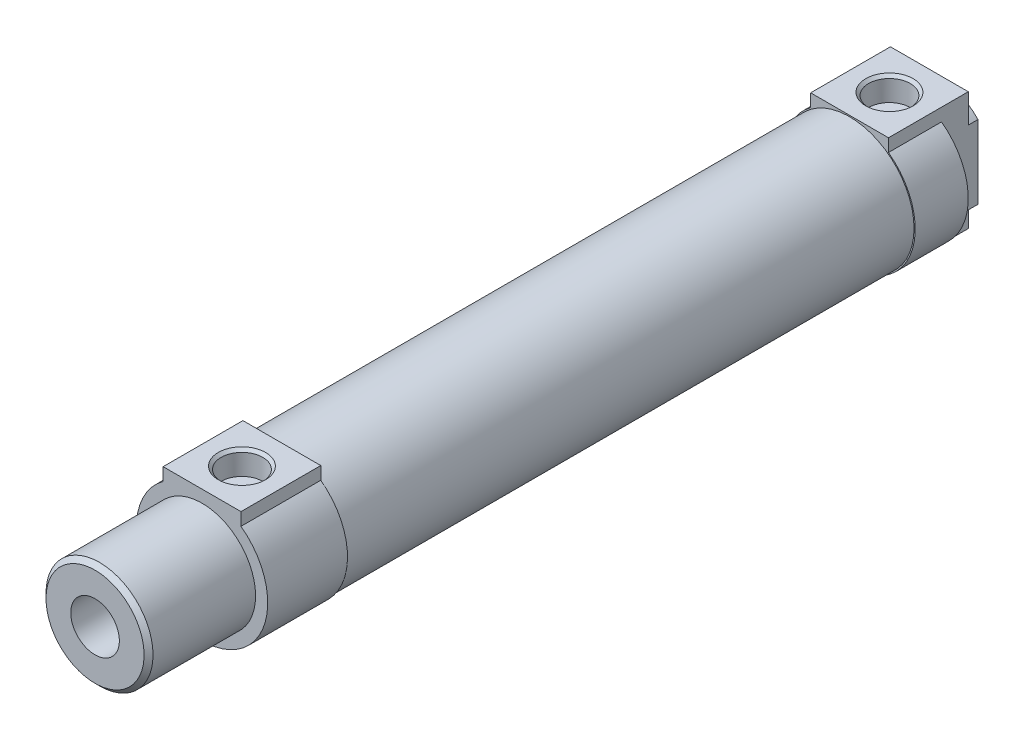
ISO-10303-21;
HEADER;
FILE_DESCRIPTION(('STEP AP214'),'2;1');
FILE_NAME('part.step','',(''),(''),'','','');
FILE_SCHEMA(('AUTOMOTIVE_DESIGN { 1 0 10303 214 1 1 1 1 }'));
ENDSEC;
DATA;
#1=APPLICATION_CONTEXT('core data for automotive mechanical design processes');
#2=APPLICATION_PROTOCOL_DEFINITION('international standard','automotive_design',2000,#1);
#3=PRODUCT_CONTEXT('',#1,'mechanical');
#4=PRODUCT('Part','Part','',(#3));
#5=PRODUCT_RELATED_PRODUCT_CATEGORY('part','',(#4));
#6=PRODUCT_DEFINITION_FORMATION('','',#4);
#7=PRODUCT_DEFINITION_CONTEXT('part definition',#1,'design');
#8=PRODUCT_DEFINITION('design','',#6,#7);
#9=PRODUCT_DEFINITION_SHAPE('','',#8);
#10=(LENGTH_UNIT() NAMED_UNIT(*) SI_UNIT(.MILLI.,.METRE.));
#11=(NAMED_UNIT(*) PLANE_ANGLE_UNIT() SI_UNIT($,.RADIAN.));
#12=(NAMED_UNIT(*) SI_UNIT($,.STERADIAN.) SOLID_ANGLE_UNIT());
#13=UNCERTAINTY_MEASURE_WITH_UNIT(LENGTH_MEASURE(1.E-05),#10,'distance_accuracy_value','');
#14=(GEOMETRIC_REPRESENTATION_CONTEXT(3) GLOBAL_UNCERTAINTY_ASSIGNED_CONTEXT((#13)) GLOBAL_UNIT_ASSIGNED_CONTEXT((#10,
#11,#12)) REPRESENTATION_CONTEXT('',''));
#15=CARTESIAN_POINT('',(0.,0.,0.));
#16=DIRECTION('',(0.,0.,1.));
#17=DIRECTION('',(1.,0.,0.));
#18=AXIS2_PLACEMENT_3D('',#15,#16,#17);
#19=CARTESIAN_POINT('',(0.,0.,-160.04));
#20=DIRECTION('',(0.,0.,1.));
#21=DIRECTION('',(1.,0.,0.));
#22=AXIS2_PLACEMENT_3D('',#19,#20,#21);
#23=CYLINDRICAL_SURFACE('',#22,11.);
#24=DIRECTION('',(0.,0.,1.));
#25=VECTOR('',#24,1.);
#26=CARTESIAN_POINT('',(-7.99999999999999,-7.54983443527077,-144.));
#27=LINE('',#26,#25);
#28=CARTESIAN_POINT('',(-7.99999999999999,-7.54983443527076,-149.5));
#29=VERTEX_POINT('',#28);
#30=CARTESIAN_POINT('',(-7.99999999999999,-7.54983443527077,-151.5));
#31=VERTEX_POINT('',#30);
#32=EDGE_CURVE('E145',#29,#31,#27,.F.);
#33=ORIENTED_EDGE('',*,*,#32,.T.);
#34=CARTESIAN_POINT('',(0.,0.,-151.5));
#35=DIRECTION('',(0.,0.,-1.));
#36=DIRECTION('',(-1.,0.,0.));
#37=AXIS2_PLACEMENT_3D('',#34,#35,#36);
#38=CIRCLE('',#37,11.);
#39=CARTESIAN_POINT('',(8.00000000000001,-7.54983443527074,-151.5));
#40=VERTEX_POINT('',#39);
#41=EDGE_CURVE('E51',#40,#31,#38,.T.);
#42=ORIENTED_EDGE('',*,*,#41,.F.);
#43=DIRECTION('',(0.,0.,1.));
#44=VECTOR('',#43,1.);
#45=CARTESIAN_POINT('',(8.00000000000001,-7.54983443527074,-172.5));
#46=LINE('',#45,#44);
#47=CARTESIAN_POINT('',(8.00000000000001,-7.54983443527074,-149.5));
#48=VERTEX_POINT('',#47);
#49=EDGE_CURVE('E151',#40,#48,#46,.T.);
#50=ORIENTED_EDGE('',*,*,#49,.T.);
#51=CARTESIAN_POINT('',(0.,0.,-149.5));
#52=DIRECTION('',(0.,0.,1.));
#53=DIRECTION('',(1.,0.,0.));
#54=AXIS2_PLACEMENT_3D('',#51,#52,#53);
#55=CIRCLE('',#54,11.);
#56=EDGE_CURVE('E137',#48,#29,#55,.F.);
#57=ORIENTED_EDGE('',*,*,#56,.T.);
#58=EDGE_LOOP('',(#33,#42,#50,#57));
#59=FACE_BOUND('',#58,.T.);
#60=ADVANCED_FACE('F34',(#59),#23,.T.);
#61=CARTESIAN_POINT('',(0.,0.,-160.04));
#62=DIRECTION('',(0.,0.,1.));
#63=DIRECTION('',(1.,0.,0.));
#64=AXIS2_PLACEMENT_3D('',#61,#62,#63);
#65=CYLINDRICAL_SURFACE('',#64,11.);
#66=DIRECTION('',(0.,0.,1.));
#67=VECTOR('',#66,1.);
#68=CARTESIAN_POINT('',(8.00000000000001,7.54983443527074,-172.5));
#69=LINE('',#68,#67);
#70=CARTESIAN_POINT('',(8.00000000000001,7.54983443527074,-149.5));
#71=VERTEX_POINT('',#70);
#72=CARTESIAN_POINT('',(8.00000000000001,7.54983443527074,-151.5));
#73=VERTEX_POINT('',#72);
#74=EDGE_CURVE('E289',#71,#73,#69,.F.);
#75=ORIENTED_EDGE('',*,*,#74,.T.);
#76=CARTESIAN_POINT('',(0.,0.,-151.5));
#77=DIRECTION('',(0.,0.,-1.));
#78=DIRECTION('',(-1.,0.,0.));
#79=AXIS2_PLACEMENT_3D('',#76,#77,#78);
#80=CIRCLE('',#79,11.);
#81=CARTESIAN_POINT('',(-7.99999999999998,7.54983443527077,-151.5));
#82=VERTEX_POINT('',#81);
#83=EDGE_CURVE('E318',#82,#73,#80,.T.);
#84=ORIENTED_EDGE('',*,*,#83,.F.);
#85=DIRECTION('',(0.,0.,1.));
#86=VECTOR('',#85,1.);
#87=CARTESIAN_POINT('',(-7.99999999999999,7.54983443527077,-144.));
#88=LINE('',#87,#86);
#89=CARTESIAN_POINT('',(-7.99999999999999,7.54983443527077,-149.5));
#90=VERTEX_POINT('',#89);
#91=EDGE_CURVE('E158',#82,#90,#88,.T.);
#92=ORIENTED_EDGE('',*,*,#91,.T.);
#93=CARTESIAN_POINT('',(0.,0.,-149.5));
#94=DIRECTION('',(0.,0.,1.));
#95=DIRECTION('',(1.,0.,0.));
#96=AXIS2_PLACEMENT_3D('',#93,#94,#95);
#97=CIRCLE('',#96,11.);
#98=EDGE_CURVE('E152',#71,#90,#97,.T.);
#99=ORIENTED_EDGE('',*,*,#98,.F.);
#100=EDGE_LOOP('',(#75,#84,#92,#99));
#101=FACE_BOUND('',#100,.T.);
#102=ADVANCED_FACE('F330',(#101),#65,.T.);
#103=CARTESIAN_POINT('',(8.00000000000001,27.,-172.5));
#104=DIRECTION('',(-1.,0.,0.));
#105=DIRECTION('',(0.,0.,1.));
#106=AXIS2_PLACEMENT_3D('',#103,#104,#105);
#107=PLANE('',#106);
#108=DIRECTION('',(0.,-1.,0.));
#109=VECTOR('',#108,1.);
#110=CARTESIAN_POINT('',(8.00000000000001,-7.54983443527074,-151.5));
#111=LINE('',#110,#109);
#112=EDGE_CURVE('E315',#73,#40,#111,.T.);
#113=ORIENTED_EDGE('',*,*,#112,.F.);
#114=ORIENTED_EDGE('',*,*,#74,.F.);
#115=DIRECTION('',(0.,1.,0.));
#116=VECTOR('',#115,1.);
#117=CARTESIAN_POINT('',(8.00000000000001,27.,-149.5));
#118=LINE('',#117,#116);
#119=CARTESIAN_POINT('',(8.00000000000001,13.5,-149.5));
#120=VERTEX_POINT('',#119);
#121=EDGE_CURVE('E231',#120,#71,#118,.F.);
#122=ORIENTED_EDGE('',*,*,#121,.F.);
#123=DIRECTION('',(0.,0.,1.));
#124=VECTOR('',#123,1.);
#125=CARTESIAN_POINT('',(8.00000000000001,13.5,0.));
#126=LINE('',#125,#124);
#127=CARTESIAN_POINT('',(8.00000000000001,13.5,-133.1));
#128=VERTEX_POINT('',#127);
#129=EDGE_CURVE('E222',#128,#120,#126,.F.);
#130=ORIENTED_EDGE('',*,*,#129,.F.);
#131=DIRECTION('',(0.,1.,0.));
#132=VECTOR('',#131,1.);
#133=CARTESIAN_POINT('',(8.00000000000001,13.375,-133.1));
#134=LINE('',#133,#132);
#135=CARTESIAN_POINT('',(8.00000000000001,10.8742815854658,-133.1));
#136=VERTEX_POINT('',#135);
#137=EDGE_CURVE('E171',#136,#128,#134,.T.);
#138=ORIENTED_EDGE('',*,*,#137,.F.);
#139=DIRECTION('',(0.,0.,1.));
#140=VECTOR('',#139,1.);
#141=CARTESIAN_POINT('',(8.00000000000001,10.8742815854658,-172.5));
#142=LINE('',#141,#140);
#143=CARTESIAN_POINT('',(8.00000000000001,10.8742815854658,-144.));
#144=VERTEX_POINT('',#143);
#145=EDGE_CURVE('E229',#144,#136,#142,.T.);
#146=ORIENTED_EDGE('',*,*,#145,.F.);
#147=DIRECTION('',(0.,1.,0.));
#148=VECTOR('',#147,1.);
#149=CARTESIAN_POINT('',(8.00000000000001,27.,-144.));
#150=LINE('',#149,#148);
#151=CARTESIAN_POINT('',(8.00000000000001,-10.8742815854658,-144.));
#152=VERTEX_POINT('',#151);
#153=EDGE_CURVE('E232',#152,#144,#150,.T.);
#154=ORIENTED_EDGE('',*,*,#153,.F.);
#155=DIRECTION('',(0.,0.,1.));
#156=VECTOR('',#155,1.);
#157=CARTESIAN_POINT('',(8.00000000000001,-10.8742815854658,-172.5));
#158=LINE('',#157,#156);
#159=CARTESIAN_POINT('',(8.00000000000001,-10.8742815854658,-149.5));
#160=VERTEX_POINT('',#159);
#161=EDGE_CURVE('E260',#160,#152,#158,.T.);
#162=ORIENTED_EDGE('',*,*,#161,.F.);
#163=DIRECTION('',(0.,1.,0.));
#164=VECTOR('',#163,1.);
#165=CARTESIAN_POINT('',(8.00000000000001,27.,-149.5));
#166=LINE('',#165,#164);
#167=EDGE_CURVE('E263',#48,#160,#166,.F.);
#168=ORIENTED_EDGE('',*,*,#167,.F.);
#169=ORIENTED_EDGE('',*,*,#49,.F.);
#170=EDGE_LOOP('',(#113,#114,#122,#130,#138,#146,#154,#162,#168,#169));
#171=FACE_BOUND('',#170,.T.);
#172=ADVANCED_FACE('F333',(#171),#107,.F.);
#173=CARTESIAN_POINT('',(-7.99999999999999,27.,-144.));
#174=DIRECTION('',(1.,0.,0.));
#175=DIRECTION('',(0.,1.,0.));
#176=AXIS2_PLACEMENT_3D('',#173,#174,#175);
#177=PLANE('',#176);
#178=DIRECTION('',(0.,1.,0.));
#179=VECTOR('',#178,1.);
#180=CARTESIAN_POINT('',(-7.99999999999999,7.54983443527077,-151.5));
#181=LINE('',#180,#179);
#182=EDGE_CURVE('E157',#31,#82,#181,.T.);
#183=ORIENTED_EDGE('',*,*,#182,.F.);
#184=ORIENTED_EDGE('',*,*,#32,.F.);
#185=DIRECTION('',(0.,1.,0.));
#186=VECTOR('',#185,1.);
#187=CARTESIAN_POINT('',(-7.99999999999999,27.,-149.5));
#188=LINE('',#187,#186);
#189=CARTESIAN_POINT('',(-7.99999999999999,-10.8742815854658,-149.5));
#190=VERTEX_POINT('',#189);
#191=EDGE_CURVE('E134',#190,#29,#188,.T.);
#192=ORIENTED_EDGE('',*,*,#191,.F.);
#193=DIRECTION('',(0.,0.,1.));
#194=VECTOR('',#193,1.);
#195=CARTESIAN_POINT('',(-7.99999999999999,-10.8742815854658,-144.));
#196=LINE('',#195,#194);
#197=CARTESIAN_POINT('',(-7.99999999999999,-10.8742815854658,-144.));
#198=VERTEX_POINT('',#197);
#199=EDGE_CURVE('E146',#198,#190,#196,.F.);
#200=ORIENTED_EDGE('',*,*,#199,.F.);
#201=DIRECTION('',(0.,1.,0.));
#202=VECTOR('',#201,1.);
#203=CARTESIAN_POINT('',(-7.99999999999999,27.,-144.));
#204=LINE('',#203,#202);
#205=CARTESIAN_POINT('',(-7.99999999999999,10.8742815854658,-144.));
#206=VERTEX_POINT('',#205);
#207=EDGE_CURVE('E213',#206,#198,#204,.F.);
#208=ORIENTED_EDGE('',*,*,#207,.F.);
#209=DIRECTION('',(0.,0.,1.));
#210=VECTOR('',#209,1.);
#211=CARTESIAN_POINT('',(-7.99999999999999,10.8742815854658,-144.));
#212=LINE('',#211,#210);
#213=CARTESIAN_POINT('',(-7.99999999999999,10.8742815854658,-133.1));
#214=VERTEX_POINT('',#213);
#215=EDGE_CURVE('E210',#214,#206,#212,.F.);
#216=ORIENTED_EDGE('',*,*,#215,.F.);
#217=DIRECTION('',(0.,1.,0.));
#218=VECTOR('',#217,1.);
#219=CARTESIAN_POINT('',(-7.99999999999999,13.375,-133.1));
#220=LINE('',#219,#218);
#221=CARTESIAN_POINT('',(-7.99999999999999,13.5,-133.1));
#222=VERTEX_POINT('',#221);
#223=EDGE_CURVE('E164',#222,#214,#220,.F.);
#224=ORIENTED_EDGE('',*,*,#223,.F.);
#225=DIRECTION('',(0.,0.,1.));
#226=VECTOR('',#225,1.);
#227=CARTESIAN_POINT('',(-7.99999999999999,13.5,-144.));
#228=LINE('',#227,#226);
#229=CARTESIAN_POINT('',(-7.99999999999999,13.5,-149.5));
#230=VERTEX_POINT('',#229);
#231=EDGE_CURVE('E214',#230,#222,#228,.T.);
#232=ORIENTED_EDGE('',*,*,#231,.F.);
#233=DIRECTION('',(0.,1.,0.));
#234=VECTOR('',#233,1.);
#235=CARTESIAN_POINT('',(-7.99999999999999,27.,-149.5));
#236=LINE('',#235,#234);
#237=EDGE_CURVE('E160',#90,#230,#236,.T.);
#238=ORIENTED_EDGE('',*,*,#237,.F.);
#239=ORIENTED_EDGE('',*,*,#91,.F.);
#240=EDGE_LOOP('',(#183,#184,#192,#200,#208,#216,#224,#232,#238,#239));
#241=FACE_BOUND('',#240,.T.);
#242=ADVANCED_FACE('F155',(#241),#177,.F.);
#243=CARTESIAN_POINT('',(0.,6.25,-127.5));
#244=DIRECTION('',(0.,0.,-1.));
#245=DIRECTION('',(-1.,0.,0.));
#246=AXIS2_PLACEMENT_3D('',#243,#244,#245);
#247=PLANE('',#246);
#248=CARTESIAN_POINT('',(0.,0.,-127.5));
#249=DIRECTION('',(0.,0.,1.));
#250=DIRECTION('',(1.,0.,0.));
#251=AXIS2_PLACEMENT_3D('',#248,#249,#250);
#252=CIRCLE('',#251,12.5);
#253=CARTESIAN_POINT('',(12.5,0.,-127.5));
#254=VERTEX_POINT('',#253);
#255=EDGE_CURVE('E38',#254,#254,#252,.T.);
#256=ORIENTED_EDGE('',*,*,#255,.T.);
#257=EDGE_LOOP('',(#256));
#258=FACE_BOUND('',#257,.T.);
#259=ADVANCED_FACE('F419',(#258),#247,.F.);
#260=CARTESIAN_POINT('',(0.,0.,-84.375));
#261=DIRECTION('',(0.,0.,1.));
#262=DIRECTION('',(1.,0.,0.));
#263=AXIS2_PLACEMENT_3D('',#260,#261,#262);
#264=CYLINDRICAL_SURFACE('',#263,12.5);
#265=CARTESIAN_POINT('',(0.,0.,-41.25));
#266=DIRECTION('',(0.,0.,1.));
#267=DIRECTION('',(1.,0.,0.));
#268=AXIS2_PLACEMENT_3D('',#265,#266,#267);
#269=CIRCLE('',#268,12.5);
#270=CARTESIAN_POINT('',(12.5,0.,-41.25));
#271=VERTEX_POINT('',#270);
#272=EDGE_CURVE('E310',#271,#271,#269,.T.);
#273=ORIENTED_EDGE('',*,*,#272,.T.);
#274=EDGE_LOOP('',(#273));
#275=FACE_BOUND('',#274,.T.);
#276=ORIENTED_EDGE('',*,*,#255,.F.);
#277=EDGE_LOOP('',(#276));
#278=FACE_BOUND('',#277,.T.);
#279=ADVANCED_FACE('F415',(#275,#278),#264,.F.);
#280=CARTESIAN_POINT('',(0.,8.75,-41.25));
#281=DIRECTION('',(0.,0.,1.));
#282=DIRECTION('',(0.,-1.,0.));
#283=AXIS2_PLACEMENT_3D('',#280,#281,#282);
#284=PLANE('',#283);
#285=ORIENTED_EDGE('',*,*,#272,.F.);
#286=EDGE_LOOP('',(#285));
#287=FACE_BOUND('',#286,.T.);
#288=CARTESIAN_POINT('',(0.,0.,-41.25));
#289=DIRECTION('',(0.,0.,1.));
#290=DIRECTION('',(1.,0.,0.));
#291=AXIS2_PLACEMENT_3D('',#288,#289,#290);
#292=CIRCLE('',#291,5.);
#293=CARTESIAN_POINT('',(5.,0.,-41.25));
#294=VERTEX_POINT('',#293);
#295=EDGE_CURVE('E308',#294,#294,#292,.T.);
#296=ORIENTED_EDGE('',*,*,#295,.T.);
#297=EDGE_LOOP('',(#296));
#298=FACE_BOUND('',#297,.T.);
#299=ADVANCED_FACE('F411',(#287,#298),#284,.F.);
#300=CARTESIAN_POINT('',(0.,0.,-9.62500000000001));
#301=DIRECTION('',(0.,0.,1.));
#302=DIRECTION('',(1.,0.,0.));
#303=AXIS2_PLACEMENT_3D('',#300,#301,#302);
#304=CYLINDRICAL_SURFACE('',#303,5.);
#305=CARTESIAN_POINT('',(0.,0.,22.));
#306=DIRECTION('',(0.,0.,1.));
#307=DIRECTION('',(1.,0.,0.));
#308=AXIS2_PLACEMENT_3D('',#305,#306,#307);
#309=CIRCLE('',#308,5.);
#310=CARTESIAN_POINT('',(5.,0.,22.));
#311=VERTEX_POINT('',#310);
#312=EDGE_CURVE('E305',#311,#311,#309,.F.);
#313=ORIENTED_EDGE('',*,*,#312,.F.);
#314=EDGE_LOOP('',(#313));
#315=FACE_BOUND('',#314,.T.);
#316=ORIENTED_EDGE('',*,*,#295,.F.);
#317=EDGE_LOOP('',(#316));
#318=FACE_BOUND('',#317,.T.);
#319=ADVANCED_FACE('F407',(#315,#318),#304,.F.);
#320=CARTESIAN_POINT('',(0.,5.04,22.));
#321=DIRECTION('',(0.,0.,1.));
#322=DIRECTION('',(1.,0.,0.));
#323=AXIS2_PLACEMENT_3D('',#320,#321,#322);
#324=PLANE('',#323);
#325=CARTESIAN_POINT('',(0.,0.,22.));
#326=DIRECTION('',(0.,0.,-1.));
#327=DIRECTION('',(-1.,0.,0.));
#328=AXIS2_PLACEMENT_3D('',#325,#326,#327);
#329=CIRCLE('',#328,10.08);
#330=CARTESIAN_POINT('',(-10.08,0.,22.));
#331=VERTEX_POINT('',#330);
#332=EDGE_CURVE('E302',#331,#331,#329,.T.);
#333=ORIENTED_EDGE('',*,*,#332,.F.);
#334=EDGE_LOOP('',(#333));
#335=FACE_BOUND('',#334,.T.);
#336=ORIENTED_EDGE('',*,*,#312,.T.);
#337=EDGE_LOOP('',(#336));
#338=FACE_BOUND('',#337,.T.);
#339=ADVANCED_FACE('F403',(#335,#338),#324,.T.);
#340=CARTESIAN_POINT('',(0.,8.636,-143.4415));
#341=DIRECTION('',(0.,-1.,0.));
#342=DIRECTION('',(0.,0.,-1.));
#343=AXIS2_PLACEMENT_3D('',#340,#341,#342);
#344=PLANE('',#343);
#345=CARTESIAN_POINT('',(0.,8.636,-141.3));
#346=DIRECTION('',(0.,1.,0.));
#347=DIRECTION('',(0.,0.,1.));
#348=AXIS2_PLACEMENT_3D('',#345,#346,#347);
#349=CIRCLE('',#348,4.28299999999999);
#350=CARTESIAN_POINT('',(0.,8.636,-137.017));
#351=VERTEX_POINT('',#350);
#352=EDGE_CURVE('E299',#351,#351,#349,.T.);
#353=ORIENTED_EDGE('',*,*,#352,.T.);
#354=EDGE_LOOP('',(#353));
#355=FACE_BOUND('',#354,.T.);
#356=ADVANCED_FACE('F399',(#355),#344,.F.);
#357=CARTESIAN_POINT('',(0.,8.636,-10.3415));
#358=DIRECTION('',(0.,-1.,0.));
#359=DIRECTION('',(0.,0.,-1.));
#360=AXIS2_PLACEMENT_3D('',#357,#358,#359);
#361=PLANE('',#360);
#362=CARTESIAN_POINT('',(0.,8.636,-8.2));
#363=DIRECTION('',(0.,1.,0.));
#364=DIRECTION('',(0.,0.,1.));
#365=AXIS2_PLACEMENT_3D('',#362,#363,#364);
#366=CIRCLE('',#365,4.283);
#367=CARTESIAN_POINT('',(0.,8.636,-3.917));
#368=VERTEX_POINT('',#367);
#369=EDGE_CURVE('E273',#368,#368,#366,.T.);
#370=ORIENTED_EDGE('',*,*,#369,.T.);
#371=EDGE_LOOP('',(#370));
#372=FACE_BOUND('',#371,.T.);
#373=ADVANCED_FACE('F395',(#372),#361,.F.);
#374=CARTESIAN_POINT('',(0.,0.,21.08));
#375=DIRECTION('',(0.,0.,-1.));
#376=DIRECTION('',(-1.,0.,0.));
#377=AXIS2_PLACEMENT_3D('',#374,#375,#376);
#378=CONICAL_SURFACE('',#377,11.,0.785398163397452);
#379=ORIENTED_EDGE('',*,*,#332,.T.);
#380=EDGE_LOOP('',(#379));
#381=FACE_BOUND('',#380,.T.);
#382=CARTESIAN_POINT('',(0.,0.,21.08));
#383=DIRECTION('',(0.,0.,1.));
#384=DIRECTION('',(1.,0.,0.));
#385=AXIS2_PLACEMENT_3D('',#382,#383,#384);
#386=CIRCLE('',#385,11.);
#387=CARTESIAN_POINT('',(11.,0.,21.08));
#388=VERTEX_POINT('',#387);
#389=EDGE_CURVE('E271',#388,#388,#386,.F.);
#390=ORIENTED_EDGE('',*,*,#389,.F.);
#391=EDGE_LOOP('',(#390));
#392=FACE_BOUND('',#391,.T.);
#393=ADVANCED_FACE('F391',(#381,#392),#378,.T.);
#394=CARTESIAN_POINT('',(0.,10.7775,-141.3));
#395=DIRECTION('',(0.,1.,0.));
#396=DIRECTION('',(0.,0.,1.));
#397=AXIS2_PLACEMENT_3D('',#394,#395,#396);
#398=CYLINDRICAL_SURFACE('',#397,4.28299999999999);
#399=CARTESIAN_POINT('',(0.,12.9190000000108,-141.3));
#400=DIRECTION('',(0.,1.,0.));
#401=DIRECTION('',(0.,0.,-1.));
#402=AXIS2_PLACEMENT_3D('',#399,#400,#401);
#403=CIRCLE('',#402,4.2829999999878);
#404=CARTESIAN_POINT('',(0.,12.9190000000108,-145.582999999988));
#405=VERTEX_POINT('',#404);
#406=EDGE_CURVE('E153',#405,#405,#403,.T.);
#407=ORIENTED_EDGE('',*,*,#406,.T.);
#408=EDGE_LOOP('',(#407));
#409=FACE_BOUND('',#408,.T.);
#410=ORIENTED_EDGE('',*,*,#352,.F.);
#411=EDGE_LOOP('',(#410));
#412=FACE_BOUND('',#411,.T.);
#413=ADVANCED_FACE('F387',(#409,#412),#398,.F.);
#414=CARTESIAN_POINT('',(0.,10.7775,-8.2));
#415=DIRECTION('',(0.,1.,0.));
#416=DIRECTION('',(0.,0.,1.));
#417=AXIS2_PLACEMENT_3D('',#414,#415,#416);
#418=CYLINDRICAL_SURFACE('',#417,4.283);
#419=CARTESIAN_POINT('',(0.,12.9190000000676,-8.2));
#420=DIRECTION('',(0.,1.,0.));
#421=DIRECTION('',(0.,0.,-1.));
#422=AXIS2_PLACEMENT_3D('',#419,#420,#421);
#423=CIRCLE('',#422,4.28300000003155);
#424=CARTESIAN_POINT('',(0.,12.9190000000676,-12.4830000000316));
#425=VERTEX_POINT('',#424);
#426=EDGE_CURVE('E265',#425,#425,#423,.T.);
#427=ORIENTED_EDGE('',*,*,#426,.T.);
#428=EDGE_LOOP('',(#427));
#429=FACE_BOUND('',#428,.T.);
#430=ORIENTED_EDGE('',*,*,#369,.F.);
#431=EDGE_LOOP('',(#430));
#432=FACE_BOUND('',#431,.T.);
#433=ADVANCED_FACE('F383',(#429,#432),#418,.F.);
#434=CARTESIAN_POINT('',(0.,0.,10.54));
#435=DIRECTION('',(0.,0.,1.));
#436=DIRECTION('',(1.,0.,0.));
#437=AXIS2_PLACEMENT_3D('',#434,#435,#436);
#438=CYLINDRICAL_SURFACE('',#437,11.);
#439=ORIENTED_EDGE('',*,*,#389,.T.);
#440=EDGE_LOOP('',(#439));
#441=FACE_BOUND('',#440,.T.);
#442=CARTESIAN_POINT('',(0.,0.,0.));
#443=DIRECTION('',(0.,0.,1.));
#444=DIRECTION('',(1.,0.,0.));
#445=AXIS2_PLACEMENT_3D('',#442,#443,#444);
#446=CIRCLE('',#445,11.);
#447=CARTESIAN_POINT('',(11.,0.,0.));
#448=VERTEX_POINT('',#447);
#449=EDGE_CURVE('E268',#448,#448,#446,.F.);
#450=ORIENTED_EDGE('',*,*,#449,.F.);
#451=EDGE_LOOP('',(#450));
#452=FACE_BOUND('',#451,.T.);
#453=ADVANCED_FACE('F379',(#441,#452),#438,.T.);
#454=CARTESIAN_POINT('',(8.00000000000001,27.,-144.));
#455=DIRECTION('',(0.,0.,1.));
#456=DIRECTION('',(1.,0.,0.));
#457=AXIS2_PLACEMENT_3D('',#454,#455,#456);
#458=PLANE('',#457);
#459=ORIENTED_EDGE('',*,*,#153,.T.);
#460=CARTESIAN_POINT('',(0.,0.,-144.));
#461=DIRECTION('',(0.,0.,1.));
#462=DIRECTION('',(1.,0.,0.));
#463=AXIS2_PLACEMENT_3D('',#460,#461,#462);
#464=CIRCLE('',#463,13.5);
#465=EDGE_CURVE('E286',#152,#144,#464,.T.);
#466=ORIENTED_EDGE('',*,*,#465,.F.);
#467=EDGE_LOOP('',(#459,#466));
#468=FACE_BOUND('',#467,.T.);
#469=ADVANCED_FACE('F375',(#468),#458,.F.);
#470=CARTESIAN_POINT('',(0.,13.5000000000218,-141.3));
#471=DIRECTION('',(0.,1.,0.));
#472=DIRECTION('',(0.,0.,1.));
#473=AXIS2_PLACEMENT_3D('',#470,#471,#472);
#474=CONICAL_SURFACE('',#473,4.86399999999884,0.785398163397448);
#475=CARTESIAN_POINT('',(0.,13.5000000000218,-141.3));
#476=DIRECTION('',(0.,1.,0.));
#477=DIRECTION('',(0.,0.,1.));
#478=AXIS2_PLACEMENT_3D('',#475,#476,#477);
#479=CIRCLE('',#478,4.86399999999884);
#480=CARTESIAN_POINT('',(0.,13.5000000000218,-136.436000000001));
#481=VERTEX_POINT('',#480);
#482=EDGE_CURVE('E226',#481,#481,#479,.F.);
#483=ORIENTED_EDGE('',*,*,#482,.F.);
#484=EDGE_LOOP('',(#483));
#485=FACE_BOUND('',#484,.T.);
#486=ORIENTED_EDGE('',*,*,#406,.F.);
#487=EDGE_LOOP('',(#486));
#488=FACE_BOUND('',#487,.T.);
#489=ADVANCED_FACE('F364',(#485,#488),#474,.F.);
#490=CARTESIAN_POINT('',(0.,12.25,-149.5));
#491=DIRECTION('',(0.,0.,-1.));
#492=DIRECTION('',(-1.,0.,0.));
#493=AXIS2_PLACEMENT_3D('',#490,#491,#492);
#494=PLANE('',#493);
#495=ORIENTED_EDGE('',*,*,#167,.T.);
#496=CARTESIAN_POINT('',(0.,0.,-149.5));
#497=DIRECTION('',(0.,0.,1.));
#498=DIRECTION('',(1.,0.,0.));
#499=AXIS2_PLACEMENT_3D('',#496,#497,#498);
#500=CIRCLE('',#499,13.5);
#501=EDGE_CURVE('E140',#190,#160,#500,.T.);
#502=ORIENTED_EDGE('',*,*,#501,.F.);
#503=ORIENTED_EDGE('',*,*,#191,.T.);
#504=ORIENTED_EDGE('',*,*,#56,.F.);
#505=EDGE_LOOP('',(#495,#502,#503,#504));
#506=FACE_BOUND('',#505,.T.);
#507=ADVANCED_FACE('F136',(#506),#494,.T.);
#508=CARTESIAN_POINT('',(0.,12.25,-149.5));
#509=DIRECTION('',(0.,0.,-1.));
#510=DIRECTION('',(-1.,0.,0.));
#511=AXIS2_PLACEMENT_3D('',#508,#509,#510);
#512=PLANE('',#511);
#513=ORIENTED_EDGE('',*,*,#121,.T.);
#514=ORIENTED_EDGE('',*,*,#98,.T.);
#515=ORIENTED_EDGE('',*,*,#237,.T.);
#516=DIRECTION('',(1.,0.,0.));
#517=VECTOR('',#516,1.);
#518=CARTESIAN_POINT('',(0.,13.5,-149.5));
#519=LINE('',#518,#517);
#520=EDGE_CURVE('E225',#120,#230,#519,.F.);
#521=ORIENTED_EDGE('',*,*,#520,.F.);
#522=EDGE_LOOP('',(#513,#514,#515,#521));
#523=FACE_BOUND('',#522,.T.);
#524=ADVANCED_FACE('F355',(#523),#512,.T.);
#525=CARTESIAN_POINT('',(-35.,27.,-144.));
#526=DIRECTION('',(0.,0.,1.));
#527=DIRECTION('',(1.,0.,0.));
#528=AXIS2_PLACEMENT_3D('',#525,#526,#527);
#529=PLANE('',#528);
#530=ORIENTED_EDGE('',*,*,#207,.T.);
#531=CARTESIAN_POINT('',(0.,0.,-144.));
#532=DIRECTION('',(0.,0.,1.));
#533=DIRECTION('',(1.,0.,0.));
#534=AXIS2_PLACEMENT_3D('',#531,#532,#533);
#535=CIRCLE('',#534,13.5);
#536=EDGE_CURVE('E291',#206,#198,#535,.T.);
#537=ORIENTED_EDGE('',*,*,#536,.F.);
#538=EDGE_LOOP('',(#530,#537));
#539=FACE_BOUND('',#538,.T.);
#540=ADVANCED_FACE('F343',(#539),#529,.F.);
#541=CARTESIAN_POINT('',(0.,13.4999999999081,-8.2));
#542=DIRECTION('',(0.,1.,0.));
#543=DIRECTION('',(0.,0.,1.));
#544=AXIS2_PLACEMENT_3D('',#541,#542,#543);
#545=CONICAL_SURFACE('',#544,4.86399999987207,0.785398163397448);
#546=CARTESIAN_POINT('',(0.,13.499999999965,-8.2));
#547=DIRECTION('',(0.,1.,0.));
#548=DIRECTION('',(0.,0.,1.));
#549=AXIS2_PLACEMENT_3D('',#546,#547,#548);
#550=CIRCLE('',#549,4.86399999992891);
#551=CARTESIAN_POINT('',(0.,13.499999999965,-3.33600000007109));
#552=VERTEX_POINT('',#551);
#553=EDGE_CURVE('E238',#552,#552,#550,.F.);
#554=ORIENTED_EDGE('',*,*,#553,.F.);
#555=EDGE_LOOP('',(#554));
#556=FACE_BOUND('',#555,.T.);
#557=ORIENTED_EDGE('',*,*,#426,.F.);
#558=EDGE_LOOP('',(#557));
#559=FACE_BOUND('',#558,.T.);
#560=ADVANCED_FACE('F362',(#556,#559),#545,.F.);
#561=CARTESIAN_POINT('',(0.,12.25,0.));
#562=DIRECTION('',(0.,0.,1.));
#563=DIRECTION('',(1.,0.,0.));
#564=AXIS2_PLACEMENT_3D('',#561,#562,#563);
#565=PLANE('',#564);
#566=CARTESIAN_POINT('',(0.,0.,0.));
#567=DIRECTION('',(0.,0.,1.));
#568=DIRECTION('',(1.,0.,0.));
#569=AXIS2_PLACEMENT_3D('',#566,#567,#568);
#570=CIRCLE('',#569,13.5);
#571=CARTESIAN_POINT('',(8.,10.8742815854658,0.));
#572=VERTEX_POINT('',#571);
#573=CARTESIAN_POINT('',(-8.,10.8742815854658,0.));
#574=VERTEX_POINT('',#573);
#575=EDGE_CURVE('E209',#572,#574,#570,.F.);
#576=ORIENTED_EDGE('',*,*,#575,.F.);
#577=DIRECTION('',(0.,1.,0.));
#578=VECTOR('',#577,1.);
#579=CARTESIAN_POINT('',(8.,0.,0.));
#580=LINE('',#579,#578);
#581=CARTESIAN_POINT('',(8.,13.5,0.));
#582=VERTEX_POINT('',#581);
#583=EDGE_CURVE('E193',#582,#572,#580,.F.);
#584=ORIENTED_EDGE('',*,*,#583,.F.);
#585=DIRECTION('',(1.,0.,0.));
#586=VECTOR('',#585,1.);
#587=CARTESIAN_POINT('',(0.,13.5,0.));
#588=LINE('',#587,#586);
#589=CARTESIAN_POINT('',(-8.,13.5,0.));
#590=VERTEX_POINT('',#589);
#591=EDGE_CURVE('E202',#590,#582,#588,.T.);
#592=ORIENTED_EDGE('',*,*,#591,.F.);
#593=DIRECTION('',(0.,1.,0.));
#594=VECTOR('',#593,1.);
#595=CARTESIAN_POINT('',(-8.,0.,0.));
#596=LINE('',#595,#594);
#597=EDGE_CURVE('E208',#574,#590,#596,.T.);
#598=ORIENTED_EDGE('',*,*,#597,.F.);
#599=EDGE_LOOP('',(#576,#584,#592,#598));
#600=FACE_BOUND('',#599,.T.);
#601=ORIENTED_EDGE('',*,*,#449,.T.);
#602=EDGE_LOOP('',(#601));
#603=FACE_BOUND('',#602,.T.);
#604=ADVANCED_FACE('F564',(#600,#603),#565,.T.);
#605=CARTESIAN_POINT('',(0.,0.,-141.3));
#606=DIRECTION('',(0.,0.,1.));
#607=DIRECTION('',(1.,0.,0.));
#608=AXIS2_PLACEMENT_3D('',#605,#606,#607);
#609=CYLINDRICAL_SURFACE('',#608,13.5);
#610=ORIENTED_EDGE('',*,*,#145,.T.);
#611=CARTESIAN_POINT('',(0.,0.,-133.1));
#612=DIRECTION('',(0.,0.,1.));
#613=DIRECTION('',(1.,0.,0.));
#614=AXIS2_PLACEMENT_3D('',#611,#612,#613);
#615=CIRCLE('',#614,13.5);
#616=EDGE_CURVE('E174',#214,#136,#615,.T.);
#617=ORIENTED_EDGE('',*,*,#616,.F.);
#618=ORIENTED_EDGE('',*,*,#215,.T.);
#619=ORIENTED_EDGE('',*,*,#536,.T.);
#620=ORIENTED_EDGE('',*,*,#199,.T.);
#621=ORIENTED_EDGE('',*,*,#501,.T.);
#622=ORIENTED_EDGE('',*,*,#161,.T.);
#623=ORIENTED_EDGE('',*,*,#465,.T.);
#624=EDGE_LOOP('',(#610,#617,#618,#619,#620,#621,#622,#623));
#625=FACE_BOUND('',#624,.T.);
#626=ADVANCED_FACE('F338',(#625),#609,.T.);
#627=CARTESIAN_POINT('',(0.,13.5,0.));
#628=DIRECTION('',(0.,1.,0.));
#629=DIRECTION('',(0.,0.,1.));
#630=AXIS2_PLACEMENT_3D('',#627,#628,#629);
#631=PLANE('',#630);
#632=ORIENTED_EDGE('',*,*,#520,.T.);
#633=ORIENTED_EDGE('',*,*,#231,.T.);
#634=DIRECTION('',(1.,0.,0.));
#635=VECTOR('',#634,1.);
#636=CARTESIAN_POINT('',(0.,13.5,-133.1));
#637=LINE('',#636,#635);
#638=EDGE_CURVE('E168',#128,#222,#637,.F.);
#639=ORIENTED_EDGE('',*,*,#638,.F.);
#640=ORIENTED_EDGE('',*,*,#129,.T.);
#641=EDGE_LOOP('',(#632,#633,#639,#640));
#642=FACE_BOUND('',#641,.T.);
#643=ORIENTED_EDGE('',*,*,#482,.T.);
#644=EDGE_LOOP('',(#643));
#645=FACE_BOUND('',#644,.T.);
#646=ADVANCED_FACE('F352',(#642,#645),#631,.T.);
#647=CARTESIAN_POINT('',(0.,0.,-8.2));
#648=DIRECTION('',(0.,0.,1.));
#649=DIRECTION('',(1.,0.,0.));
#650=AXIS2_PLACEMENT_3D('',#647,#648,#649);
#651=CYLINDRICAL_SURFACE('',#650,13.5);
#652=DIRECTION('',(0.,0.,1.));
#653=VECTOR('',#652,1.);
#654=CARTESIAN_POINT('',(-8.,10.8742815854658,0.));
#655=LINE('',#654,#653);
#656=CARTESIAN_POINT('',(-8.,10.8742815854658,-16.4));
#657=VERTEX_POINT('',#656);
#658=EDGE_CURVE('E205',#657,#574,#655,.T.);
#659=ORIENTED_EDGE('',*,*,#658,.F.);
#660=CARTESIAN_POINT('',(0.,0.,-16.4));
#661=DIRECTION('',(0.,0.,1.));
#662=DIRECTION('',(1.,0.,0.));
#663=AXIS2_PLACEMENT_3D('',#660,#661,#662);
#664=CIRCLE('',#663,13.5);
#665=CARTESIAN_POINT('',(8.,10.8742815854658,-16.4));
#666=VERTEX_POINT('',#665);
#667=EDGE_CURVE('E167',#666,#657,#664,.F.);
#668=ORIENTED_EDGE('',*,*,#667,.F.);
#669=DIRECTION('',(0.,0.,1.));
#670=VECTOR('',#669,1.);
#671=CARTESIAN_POINT('',(8.,10.8742815854658,-16.4));
#672=LINE('',#671,#670);
#673=EDGE_CURVE('E188',#572,#666,#672,.F.);
#674=ORIENTED_EDGE('',*,*,#673,.F.);
#675=ORIENTED_EDGE('',*,*,#575,.T.);
#676=EDGE_LOOP('',(#659,#668,#674,#675));
#677=FACE_BOUND('',#676,.T.);
#678=ADVANCED_FACE('F442',(#677),#651,.T.);
#679=CARTESIAN_POINT('',(-8.,0.,0.));
#680=DIRECTION('',(-1.,0.,0.));
#681=DIRECTION('',(0.,0.,1.));
#682=AXIS2_PLACEMENT_3D('',#679,#680,#681);
#683=PLANE('',#682);
#684=DIRECTION('',(0.,0.,1.));
#685=VECTOR('',#684,1.);
#686=CARTESIAN_POINT('',(-8.,13.5,0.));
#687=LINE('',#686,#685);
#688=CARTESIAN_POINT('',(-8.,13.5,-16.4));
#689=VERTEX_POINT('',#688);
#690=EDGE_CURVE('E191',#689,#590,#687,.T.);
#691=ORIENTED_EDGE('',*,*,#690,.F.);
#692=DIRECTION('',(0.,1.,0.));
#693=VECTOR('',#692,1.);
#694=CARTESIAN_POINT('',(-8.,13.375,-16.4));
#695=LINE('',#694,#693);
#696=EDGE_CURVE('E183',#657,#689,#695,.T.);
#697=ORIENTED_EDGE('',*,*,#696,.F.);
#698=ORIENTED_EDGE('',*,*,#658,.T.);
#699=ORIENTED_EDGE('',*,*,#597,.T.);
#700=EDGE_LOOP('',(#691,#697,#698,#699));
#701=FACE_BOUND('',#700,.T.);
#702=ADVANCED_FACE('F445',(#701),#683,.T.);
#703=CARTESIAN_POINT('',(0.,13.5,0.));
#704=DIRECTION('',(0.,1.,0.));
#705=DIRECTION('',(0.,0.,1.));
#706=AXIS2_PLACEMENT_3D('',#703,#704,#705);
#707=PLANE('',#706);
#708=DIRECTION('',(-1.,0.,0.));
#709=VECTOR('',#708,1.);
#710=CARTESIAN_POINT('',(0.,13.5,-16.4));
#711=LINE('',#710,#709);
#712=CARTESIAN_POINT('',(8.,13.5,-16.4));
#713=VERTEX_POINT('',#712);
#714=EDGE_CURVE('E180',#689,#713,#711,.F.);
#715=ORIENTED_EDGE('',*,*,#714,.F.);
#716=ORIENTED_EDGE('',*,*,#690,.T.);
#717=ORIENTED_EDGE('',*,*,#591,.T.);
#718=DIRECTION('',(0.,0.,1.));
#719=VECTOR('',#718,1.);
#720=CARTESIAN_POINT('',(8.,13.5,-16.4));
#721=LINE('',#720,#719);
#722=EDGE_CURVE('E60',#713,#582,#721,.T.);
#723=ORIENTED_EDGE('',*,*,#722,.F.);
#724=EDGE_LOOP('',(#715,#716,#717,#723));
#725=FACE_BOUND('',#724,.T.);
#726=ORIENTED_EDGE('',*,*,#553,.T.);
#727=EDGE_LOOP('',(#726));
#728=FACE_BOUND('',#727,.T.);
#729=ADVANCED_FACE('F449',(#725,#728),#707,.T.);
#730=CARTESIAN_POINT('',(8.,0.,-16.4));
#731=DIRECTION('',(1.,0.,0.));
#732=DIRECTION('',(0.,1.,0.));
#733=AXIS2_PLACEMENT_3D('',#730,#731,#732);
#734=PLANE('',#733);
#735=ORIENTED_EDGE('',*,*,#722,.T.);
#736=ORIENTED_EDGE('',*,*,#583,.T.);
#737=ORIENTED_EDGE('',*,*,#673,.T.);
#738=DIRECTION('',(0.,1.,0.));
#739=VECTOR('',#738,1.);
#740=CARTESIAN_POINT('',(8.,13.375,-16.4));
#741=LINE('',#740,#739);
#742=EDGE_CURVE('E177',#713,#666,#741,.F.);
#743=ORIENTED_EDGE('',*,*,#742,.F.);
#744=EDGE_LOOP('',(#735,#736,#737,#743));
#745=FACE_BOUND('',#744,.T.);
#746=ADVANCED_FACE('F453',(#745),#734,.T.);
#747=CARTESIAN_POINT('',(0.,13.375,-133.1));
#748=DIRECTION('',(0.,0.,1.));
#749=DIRECTION('',(1.,0.,0.));
#750=AXIS2_PLACEMENT_3D('',#747,#748,#749);
#751=PLANE('',#750);
#752=CARTESIAN_POINT('',(0.,0.,-133.1));
#753=DIRECTION('',(0.,0.,1.));
#754=DIRECTION('',(1.,0.,0.));
#755=AXIS2_PLACEMENT_3D('',#752,#753,#754);
#756=CIRCLE('',#755,13.25);
#757=CARTESIAN_POINT('',(13.25,0.,-133.1));
#758=VERTEX_POINT('',#757);
#759=EDGE_CURVE('E43',#758,#758,#756,.T.);
#760=ORIENTED_EDGE('',*,*,#759,.F.);
#761=EDGE_LOOP('',(#760));
#762=FACE_BOUND('',#761,.T.);
#763=ORIENTED_EDGE('',*,*,#638,.T.);
#764=ORIENTED_EDGE('',*,*,#223,.T.);
#765=ORIENTED_EDGE('',*,*,#616,.T.);
#766=ORIENTED_EDGE('',*,*,#137,.T.);
#767=EDGE_LOOP('',(#763,#764,#765,#766));
#768=FACE_BOUND('',#767,.T.);
#769=ADVANCED_FACE('F347',(#762,#768),#751,.T.);
#770=CARTESIAN_POINT('',(0.,13.375,-16.4));
#771=DIRECTION('',(0.,0.,-1.));
#772=DIRECTION('',(-1.,0.,0.));
#773=AXIS2_PLACEMENT_3D('',#770,#771,#772);
#774=PLANE('',#773);
#775=CARTESIAN_POINT('',(0.,0.,-16.4));
#776=DIRECTION('',(0.,0.,1.));
#777=DIRECTION('',(1.,0.,0.));
#778=AXIS2_PLACEMENT_3D('',#775,#776,#777);
#779=CIRCLE('',#778,13.25);
#780=CARTESIAN_POINT('',(13.25,0.,-16.4));
#781=VERTEX_POINT('',#780);
#782=EDGE_CURVE('E11',#781,#781,#779,.F.);
#783=ORIENTED_EDGE('',*,*,#782,.F.);
#784=EDGE_LOOP('',(#783));
#785=FACE_BOUND('',#784,.T.);
#786=ORIENTED_EDGE('',*,*,#714,.T.);
#787=ORIENTED_EDGE('',*,*,#742,.T.);
#788=ORIENTED_EDGE('',*,*,#667,.T.);
#789=ORIENTED_EDGE('',*,*,#696,.T.);
#790=EDGE_LOOP('',(#786,#787,#788,#789));
#791=FACE_BOUND('',#790,.T.);
#792=ADVANCED_FACE('F427',(#785,#791),#774,.T.);
#793=CARTESIAN_POINT('',(0.,0.,-74.75));
#794=DIRECTION('',(0.,0.,1.));
#795=DIRECTION('',(1.,0.,0.));
#796=AXIS2_PLACEMENT_3D('',#793,#794,#795);
#797=CYLINDRICAL_SURFACE('',#796,13.25);
#798=ORIENTED_EDGE('',*,*,#759,.T.);
#799=EDGE_LOOP('',(#798));
#800=FACE_BOUND('',#799,.T.);
#801=ORIENTED_EDGE('',*,*,#782,.T.);
#802=EDGE_LOOP('',(#801));
#803=FACE_BOUND('',#802,.T.);
#804=ADVANCED_FACE('F36',(#800,#803),#797,.T.);
#805=CARTESIAN_POINT('',(0.,0.,-151.5));
#806=DIRECTION('',(0.,0.,-1.));
#807=DIRECTION('',(-1.,0.,0.));
#808=AXIS2_PLACEMENT_3D('',#805,#806,#807);
#809=PLANE('',#808);
#810=ORIENTED_EDGE('',*,*,#41,.T.);
#811=ORIENTED_EDGE('',*,*,#182,.T.);
#812=ORIENTED_EDGE('',*,*,#83,.T.);
#813=ORIENTED_EDGE('',*,*,#112,.T.);
#814=EDGE_LOOP('',(#810,#811,#812,#813));
#815=FACE_BOUND('',#814,.T.);
#816=ADVANCED_FACE('F422',(#815),#809,.T.);
#817=CLOSED_SHELL('',(#60,#102,#172,#242,#259,#279,#299,#319,#339,#356,#373,#393,#413,#433,#453,
#469,#489,#507,#524,#540,#560,#604,#626,#646,#678,#702,#729,#746,#769,#792,#804,#816));
#818=MANIFOLD_SOLID_BREP('B2',#817);
#819=ADVANCED_BREP_SHAPE_REPRESENTATION('',(#18,#818),#14);
#820=SHAPE_DEFINITION_REPRESENTATION(#9,#819);
ENDSEC;
END-ISO-10303-21;
